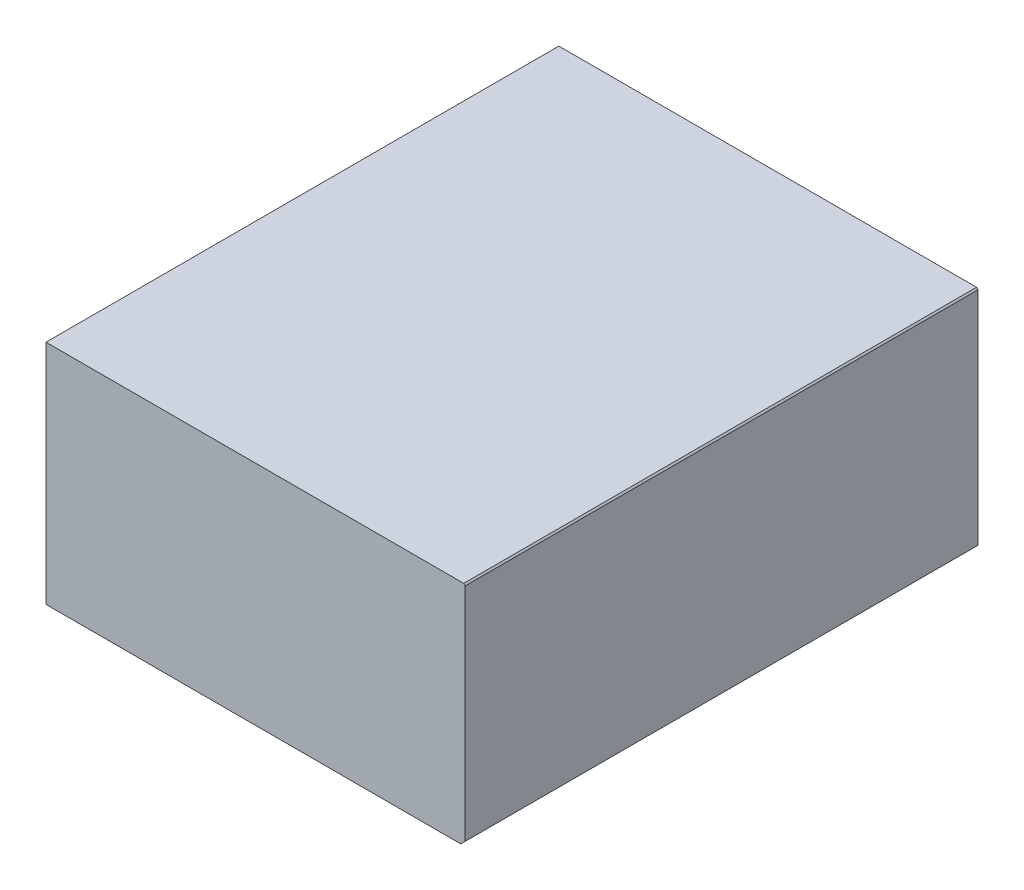
ISO-10303-21;
HEADER;
FILE_DESCRIPTION(('STEP AP214'),'2;1');
FILE_NAME('part.step','',(''),(''),'','','');
FILE_SCHEMA(('AUTOMOTIVE_DESIGN { 1 0 10303 214 1 1 1 1 }'));
ENDSEC;
DATA;
#1=APPLICATION_CONTEXT('core data for automotive mechanical design processes');
#2=APPLICATION_PROTOCOL_DEFINITION('international standard','automotive_design',2000,#1);
#3=PRODUCT_CONTEXT('',#1,'mechanical');
#4=PRODUCT('Part','Part','',(#3));
#5=PRODUCT_RELATED_PRODUCT_CATEGORY('part','',(#4));
#6=PRODUCT_DEFINITION_FORMATION('','',#4);
#7=PRODUCT_DEFINITION_CONTEXT('part definition',#1,'design');
#8=PRODUCT_DEFINITION('design','',#6,#7);
#9=PRODUCT_DEFINITION_SHAPE('','',#8);
#10=(LENGTH_UNIT() NAMED_UNIT(*) SI_UNIT(.MILLI.,.METRE.));
#11=(NAMED_UNIT(*) PLANE_ANGLE_UNIT() SI_UNIT($,.RADIAN.));
#12=(NAMED_UNIT(*) SI_UNIT($,.STERADIAN.) SOLID_ANGLE_UNIT());
#13=UNCERTAINTY_MEASURE_WITH_UNIT(LENGTH_MEASURE(1.E-05),#10,'distance_accuracy_value','');
#14=(GEOMETRIC_REPRESENTATION_CONTEXT(3) GLOBAL_UNCERTAINTY_ASSIGNED_CONTEXT((#13)) GLOBAL_UNIT_ASSIGNED_CONTEXT((#10,
#11,#12)) REPRESENTATION_CONTEXT('',''));
#15=CARTESIAN_POINT('',(0.,0.,0.));
#16=DIRECTION('',(0.,0.,1.));
#17=DIRECTION('',(1.,0.,0.));
#18=AXIS2_PLACEMENT_3D('',#15,#16,#17);
#19=CARTESIAN_POINT('',(2.8607385,-1.48999956,0.));
#20=DIRECTION('',(0.707106781186048,-0.707106781187048,0.));
#21=DIRECTION('',(0.707106781187048,0.707106781186048,0.));
#22=AXIS2_PLACEMENT_3D('',#19,#20,#21);
#23=PLANE('',#22);
#24=DIRECTION('',(0.,0.,-1.));
#25=VECTOR('',#24,1.);
#26=CARTESIAN_POINT('',(2.80073862,-1.54999944,0.));
#27=LINE('',#26,#25);
#28=CARTESIAN_POINT('',(2.80073861999998,-1.54999943999998,0.));
#29=VERTEX_POINT('',#28);
#30=CARTESIAN_POINT('',(2.80073861999998,-1.54999943999998,7.00000124));
#31=VERTEX_POINT('',#30);
#32=EDGE_CURVE('E88',#29,#31,#27,.F.);
#33=ORIENTED_EDGE('',*,*,#32,.F.);
#34=DIRECTION('',(0.707106781187048,0.707106781186048,0.));
#35=VECTOR('',#34,1.);
#36=CARTESIAN_POINT('',(2.8607385,-1.48999956,0.));
#37=LINE('',#36,#35);
#38=CARTESIAN_POINT('',(2.8607385,-1.48999956,0.));
#39=VERTEX_POINT('',#38);
#40=EDGE_CURVE('E101',#29,#39,#37,.T.);
#41=ORIENTED_EDGE('',*,*,#40,.T.);
#42=DIRECTION('',(0.,0.,-1.));
#43=VECTOR('',#42,1.);
#44=CARTESIAN_POINT('',(2.8607385,-1.48999956,0.));
#45=LINE('',#44,#43);
#46=CARTESIAN_POINT('',(2.8607385,-1.48999956,7.00000124));
#47=VERTEX_POINT('',#46);
#48=EDGE_CURVE('E83',#47,#39,#45,.T.);
#49=ORIENTED_EDGE('',*,*,#48,.F.);
#50=DIRECTION('',(0.707106781187048,0.707106781186048,0.));
#51=VECTOR('',#50,1.);
#52=CARTESIAN_POINT('',(2.8607385,-1.48999956,7.00000124));
#53=LINE('',#52,#51);
#54=EDGE_CURVE('E20',#47,#31,#53,.F.);
#55=ORIENTED_EDGE('',*,*,#54,.T.);
#56=EDGE_LOOP('',(#33,#41,#49,#55));
#57=FACE_BOUND('',#56,.T.);
#58=ADVANCED_FACE('F17',(#57),#23,.T.);
#59=CARTESIAN_POINT('',(2.80073862,-1.54999944,0.));
#60=DIRECTION('',(0.,-1.,0.));
#61=DIRECTION('',(0.,0.,-1.));
#62=AXIS2_PLACEMENT_3D('',#59,#60,#61);
#63=PLANE('',#62);
#64=DIRECTION('',(0.,0.,1.));
#65=VECTOR('',#64,1.);
#66=CARTESIAN_POINT('',(-2.8607385,-1.54999944,0.));
#67=LINE('',#66,#65);
#68=CARTESIAN_POINT('',(-2.8607385,-1.54999944,0.));
#69=VERTEX_POINT('',#68);
#70=CARTESIAN_POINT('',(-2.8607385,-1.54999944,7.00000124));
#71=VERTEX_POINT('',#70);
#72=EDGE_CURVE('E72',#69,#71,#67,.T.);
#73=ORIENTED_EDGE('',*,*,#72,.F.);
#74=DIRECTION('',(1.,0.,0.));
#75=VECTOR('',#74,1.);
#76=CARTESIAN_POINT('',(-2.8607385,-1.54999944,0.));
#77=LINE('',#76,#75);
#78=EDGE_CURVE('E110',#69,#29,#77,.T.);
#79=ORIENTED_EDGE('',*,*,#78,.T.);
#80=ORIENTED_EDGE('',*,*,#32,.T.);
#81=DIRECTION('',(1.,0.,0.));
#82=VECTOR('',#81,1.);
#83=CARTESIAN_POINT('',(-2.8607385,-1.54999944,7.00000124));
#84=LINE('',#83,#82);
#85=EDGE_CURVE('E86',#71,#31,#84,.T.);
#86=ORIENTED_EDGE('',*,*,#85,.F.);
#87=EDGE_LOOP('',(#73,#79,#80,#86));
#88=FACE_BOUND('',#87,.T.);
#89=ADVANCED_FACE('F87',(#88),#63,.T.);
#90=CARTESIAN_POINT('',(2.8607385,1.52999948,0.));
#91=DIRECTION('',(1.,0.,0.));
#92=DIRECTION('',(0.,0.,-1.));
#93=AXIS2_PLACEMENT_3D('',#90,#91,#92);
#94=PLANE('',#93);
#95=ORIENTED_EDGE('',*,*,#48,.T.);
#96=DIRECTION('',(0.,1.,0.));
#97=VECTOR('',#96,1.);
#98=CARTESIAN_POINT('',(2.8607385,1.54999944,0.));
#99=LINE('',#98,#97);
#100=CARTESIAN_POINT('',(2.86073849999999,1.52999947999999,0.));
#101=VERTEX_POINT('',#100);
#102=EDGE_CURVE('E108',#39,#101,#99,.T.);
#103=ORIENTED_EDGE('',*,*,#102,.T.);
#104=DIRECTION('',(0.,0.,1.));
#105=VECTOR('',#104,1.);
#106=CARTESIAN_POINT('',(2.86073849999997,1.52999947999997,0.));
#107=LINE('',#106,#105);
#108=CARTESIAN_POINT('',(2.86073849999999,1.52999947999999,7.00000124));
#109=VERTEX_POINT('',#108);
#110=EDGE_CURVE('E118',#109,#101,#107,.F.);
#111=ORIENTED_EDGE('',*,*,#110,.F.);
#112=DIRECTION('',(0.,1.,0.));
#113=VECTOR('',#112,1.);
#114=CARTESIAN_POINT('',(2.8607385,1.54999944,7.00000124));
#115=LINE('',#114,#113);
#116=EDGE_CURVE('E90',#47,#109,#115,.T.);
#117=ORIENTED_EDGE('',*,*,#116,.F.);
#118=EDGE_LOOP('',(#95,#103,#111,#117));
#119=FACE_BOUND('',#118,.T.);
#120=ADVANCED_FACE('F106',(#119),#94,.T.);
#121=CARTESIAN_POINT('',(-2.8607385,-1.54999944,0.));
#122=DIRECTION('',(-1.,0.,0.));
#123=DIRECTION('',(0.,0.,1.));
#124=AXIS2_PLACEMENT_3D('',#121,#122,#123);
#125=PLANE('',#124);
#126=DIRECTION('',(0.,0.,1.));
#127=VECTOR('',#126,1.);
#128=CARTESIAN_POINT('',(-2.8607385,1.54999944,0.));
#129=LINE('',#128,#127);
#130=CARTESIAN_POINT('',(-2.8607385,1.54999944,0.));
#131=VERTEX_POINT('',#130);
#132=CARTESIAN_POINT('',(-2.8607385,1.54999944,7.00000124));
#133=VERTEX_POINT('',#132);
#134=EDGE_CURVE('E112',#131,#133,#129,.T.);
#135=ORIENTED_EDGE('',*,*,#134,.F.);
#136=DIRECTION('',(0.,1.,0.));
#137=VECTOR('',#136,1.);
#138=CARTESIAN_POINT('',(-2.8607385,1.54999944,0.));
#139=LINE('',#138,#137);
#140=EDGE_CURVE('E79',#131,#69,#139,.F.);
#141=ORIENTED_EDGE('',*,*,#140,.T.);
#142=ORIENTED_EDGE('',*,*,#72,.T.);
#143=DIRECTION('',(0.,1.,0.));
#144=VECTOR('',#143,1.);
#145=CARTESIAN_POINT('',(-2.8607385,1.54999944,7.00000124));
#146=LINE('',#145,#144);
#147=EDGE_CURVE('E76',#133,#71,#146,.F.);
#148=ORIENTED_EDGE('',*,*,#147,.F.);
#149=EDGE_LOOP('',(#135,#141,#142,#148));
#150=FACE_BOUND('',#149,.T.);
#151=ADVANCED_FACE('F74',(#150),#125,.T.);
#152=CARTESIAN_POINT('',(-2.8607385,1.54999944,7.00000124));
#153=DIRECTION('',(0.,0.,1.));
#154=DIRECTION('',(1.,0.,0.));
#155=AXIS2_PLACEMENT_3D('',#152,#153,#154);
#156=PLANE('',#155);
#157=DIRECTION('',(-0.707106781185548,0.707106781187548,0.));
#158=VECTOR('',#157,1.);
#159=CARTESIAN_POINT('',(2.84073854,1.54999944,7.00000124));
#160=LINE('',#159,#158);
#161=CARTESIAN_POINT('',(2.84073854,1.54999944,7.00000124));
#162=VERTEX_POINT('',#161);
#163=EDGE_CURVE('E120',#162,#109,#160,.F.);
#164=ORIENTED_EDGE('',*,*,#163,.F.);
#165=DIRECTION('',(1.,0.,0.));
#166=VECTOR('',#165,1.);
#167=CARTESIAN_POINT('',(-2.8607385,1.54999944,7.00000124));
#168=LINE('',#167,#166);
#169=EDGE_CURVE('E94',#133,#162,#168,.T.);
#170=ORIENTED_EDGE('',*,*,#169,.F.);
#171=ORIENTED_EDGE('',*,*,#147,.T.);
#172=ORIENTED_EDGE('',*,*,#85,.T.);
#173=ORIENTED_EDGE('',*,*,#54,.F.);
#174=ORIENTED_EDGE('',*,*,#116,.T.);
#175=EDGE_LOOP('',(#164,#170,#171,#172,#173,#174));
#176=FACE_BOUND('',#175,.T.);
#177=ADVANCED_FACE('F92',(#176),#156,.T.);
#178=CARTESIAN_POINT('',(2.84073854,1.54999944,0.));
#179=DIRECTION('',(0.707106781187548,0.707106781185548,0.));
#180=DIRECTION('',(-0.707106781185548,0.707106781187548,0.));
#181=AXIS2_PLACEMENT_3D('',#178,#179,#180);
#182=PLANE('',#181);
#183=ORIENTED_EDGE('',*,*,#110,.T.);
#184=DIRECTION('',(-0.707106781186551,0.707106781186544,0.));
#185=VECTOR('',#184,1.);
#186=CARTESIAN_POINT('',(2.8607385,1.52999948,0.));
#187=LINE('',#186,#185);
#188=CARTESIAN_POINT('',(2.84073854,1.54999944,0.));
#189=VERTEX_POINT('',#188);
#190=EDGE_CURVE('E35',#101,#189,#187,.T.);
#191=ORIENTED_EDGE('',*,*,#190,.T.);
#192=DIRECTION('',(0.,0.,1.));
#193=VECTOR('',#192,1.);
#194=CARTESIAN_POINT('',(2.84073854,1.54999944,0.));
#195=LINE('',#194,#193);
#196=EDGE_CURVE('E26',#162,#189,#195,.F.);
#197=ORIENTED_EDGE('',*,*,#196,.F.);
#198=ORIENTED_EDGE('',*,*,#163,.T.);
#199=EDGE_LOOP('',(#183,#191,#197,#198));
#200=FACE_BOUND('',#199,.T.);
#201=ADVANCED_FACE('F122',(#200),#182,.T.);
#202=CARTESIAN_POINT('',(-2.8607385,1.54999944,0.));
#203=DIRECTION('',(0.,0.,1.));
#204=DIRECTION('',(1.,0.,0.));
#205=AXIS2_PLACEMENT_3D('',#202,#203,#204);
#206=PLANE('',#205);
#207=ORIENTED_EDGE('',*,*,#190,.F.);
#208=ORIENTED_EDGE('',*,*,#102,.F.);
#209=ORIENTED_EDGE('',*,*,#40,.F.);
#210=ORIENTED_EDGE('',*,*,#78,.F.);
#211=ORIENTED_EDGE('',*,*,#140,.F.);
#212=DIRECTION('',(1.,0.,0.));
#213=VECTOR('',#212,1.);
#214=CARTESIAN_POINT('',(-2.8607385,1.54999944,0.));
#215=LINE('',#214,#213);
#216=EDGE_CURVE('E11',#189,#131,#215,.F.);
#217=ORIENTED_EDGE('',*,*,#216,.F.);
#218=EDGE_LOOP('',(#207,#208,#209,#210,#211,#217));
#219=FACE_BOUND('',#218,.T.);
#220=ADVANCED_FACE('F109',(#219),#206,.F.);
#221=CARTESIAN_POINT('',(-2.8607385,1.54999944,0.));
#222=DIRECTION('',(0.,1.,0.));
#223=DIRECTION('',(0.,0.,1.));
#224=AXIS2_PLACEMENT_3D('',#221,#222,#223);
#225=PLANE('',#224);
#226=ORIENTED_EDGE('',*,*,#196,.T.);
#227=ORIENTED_EDGE('',*,*,#216,.T.);
#228=ORIENTED_EDGE('',*,*,#134,.T.);
#229=ORIENTED_EDGE('',*,*,#169,.T.);
#230=EDGE_LOOP('',(#226,#227,#228,#229));
#231=FACE_BOUND('',#230,.T.);
#232=ADVANCED_FACE('F126',(#231),#225,.T.);
#233=CLOSED_SHELL('',(#58,#89,#120,#151,#177,#201,#220,#232));
#234=MANIFOLD_SOLID_BREP('B1',#233);
#235=ADVANCED_BREP_SHAPE_REPRESENTATION('',(#18,#234),#14);
#236=SHAPE_DEFINITION_REPRESENTATION(#9,#235);
ENDSEC;
END-ISO-10303-21;
